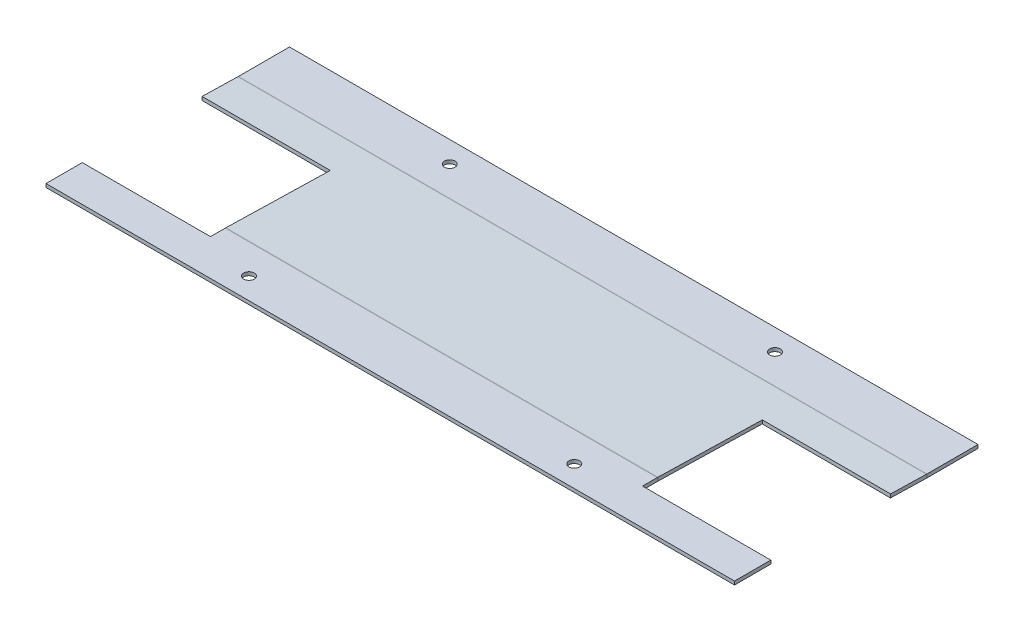
ISO-10303-21;
HEADER;
FILE_DESCRIPTION(('STEP AP214'),'2;1');
FILE_NAME('part.step','',(''),(''),'','','');
FILE_SCHEMA(('AUTOMOTIVE_DESIGN { 1 0 10303 214 1 1 1 1 }'));
ENDSEC;
DATA;
#1=APPLICATION_CONTEXT('core data for automotive mechanical design processes');
#2=APPLICATION_PROTOCOL_DEFINITION('international standard','automotive_design',2000,#1);
#3=PRODUCT_CONTEXT('',#1,'mechanical');
#4=PRODUCT('Part','Part','',(#3));
#5=PRODUCT_RELATED_PRODUCT_CATEGORY('part','',(#4));
#6=PRODUCT_DEFINITION_FORMATION('','',#4);
#7=PRODUCT_DEFINITION_CONTEXT('part definition',#1,'design');
#8=PRODUCT_DEFINITION('design','',#6,#7);
#9=PRODUCT_DEFINITION_SHAPE('','',#8);
#10=(LENGTH_UNIT() NAMED_UNIT(*) SI_UNIT(.MILLI.,.METRE.));
#11=(NAMED_UNIT(*) PLANE_ANGLE_UNIT() SI_UNIT($,.RADIAN.));
#12=(NAMED_UNIT(*) SI_UNIT($,.STERADIAN.) SOLID_ANGLE_UNIT());
#13=UNCERTAINTY_MEASURE_WITH_UNIT(LENGTH_MEASURE(1.E-05),#10,'distance_accuracy_value','');
#14=(GEOMETRIC_REPRESENTATION_CONTEXT(3) GLOBAL_UNCERTAINTY_ASSIGNED_CONTEXT((#13)) GLOBAL_UNIT_ASSIGNED_CONTEXT((#10,
#11,#12)) REPRESENTATION_CONTEXT('',''));
#15=CARTESIAN_POINT('',(0.,0.,0.));
#16=DIRECTION('',(0.,0.,1.));
#17=DIRECTION('',(1.,0.,0.));
#18=AXIS2_PLACEMENT_3D('',#15,#16,#17);
#19=CARTESIAN_POINT('',(-201.34,0.,-97.4));
#20=DIRECTION('',(1.,0.,0.));
#21=DIRECTION('',(0.,0.0246284496077068,0.999696673731548));
#22=AXIS2_PLACEMENT_3D('',#19,#20,#21);
#23=PLANE('',#22);
#24=DIRECTION('',(0.,-0.0246284496077068,-0.999696673731548));
#25=VECTOR('',#24,1.);
#26=CARTESIAN_POINT('',(-201.34,0.36869912172874,-0.00908324292608424));
#27=LINE('',#26,#25);
#28=CARTESIAN_POINT('',(-201.34,-2.02635098499052,-97.22688067823));
#29=VERTEX_POINT('',#28);
#30=CARTESIAN_POINT('',(-201.34,-1.5086422619199,-76.2124970422602));
#31=VERTEX_POINT('',#30);
#32=EDGE_CURVE('E284',#29,#31,#27,.F.);
#33=ORIENTED_EDGE('',*,*,#32,.T.);
#34=DIRECTION('',(0.,0.999696673731548,-0.0246284496077068));
#35=VECTOR('',#34,1.);
#36=CARTESIAN_POINT('',(-201.34,-1.5086422619199,-76.2124970422602));
#37=LINE('',#36,#35);
#38=CARTESIAN_POINT('',(-201.34,0.520741985755138,-76.2624927949639));
#39=VERTEX_POINT('',#38);
#40=EDGE_CURVE('E346',#39,#31,#37,.F.);
#41=ORIENTED_EDGE('',*,*,#40,.F.);
#42=DIRECTION('',(0.,0.0246284496077068,0.999696673731548));
#43=VECTOR('',#42,1.);
#44=CARTESIAN_POINT('',(-201.34,0.,-97.4));
#45=LINE('',#44,#43);
#46=CARTESIAN_POINT('',(-201.34,0.00303326268452368,-97.2768764309336));
#47=VERTEX_POINT('',#46);
#48=EDGE_CURVE('E229',#47,#39,#45,.T.);
#49=ORIENTED_EDGE('',*,*,#48,.F.);
#50=DIRECTION('',(0.,0.999696673731548,-0.0246284496077068));
#51=VECTOR('',#50,1.);
#52=CARTESIAN_POINT('',(-201.34,0.00303326268452368,-97.2768764309336));
#53=LINE('',#52,#51);
#54=EDGE_CURVE('E12',#29,#47,#53,.T.);
#55=ORIENTED_EDGE('',*,*,#54,.F.);
#56=EDGE_LOOP('',(#33,#41,#49,#55));
#57=FACE_BOUND('',#56,.T.);
#58=ADVANCED_FACE('F51',(#57),#23,.F.);
#59=CARTESIAN_POINT('',(-201.34,2.03,15.));
#60=DIRECTION('',(1.,0.,0.));
#61=DIRECTION('',(0.,0.,1.));
#62=AXIS2_PLACEMENT_3D('',#59,#60,#61);
#63=PLANE('',#62);
#64=DIRECTION('',(0.,0.,1.));
#65=VECTOR('',#64,1.);
#66=CARTESIAN_POINT('',(-201.34,2.03,15.));
#67=LINE('',#66,#65);
#68=CARTESIAN_POINT('',(-201.34,2.03,-6.21249704226017));
#69=VERTEX_POINT('',#68);
#70=CARTESIAN_POINT('',(-201.34,2.03,15.));
#71=VERTEX_POINT('',#70);
#72=EDGE_CURVE('E217',#69,#71,#67,.T.);
#73=ORIENTED_EDGE('',*,*,#72,.F.);
#74=DIRECTION('',(0.,1.,0.));
#75=VECTOR('',#74,1.);
#76=CARTESIAN_POINT('',(-201.34,0.,-6.21249704226017));
#77=LINE('',#76,#75);
#78=CARTESIAN_POINT('',(-201.34,0.,-6.21249704226017));
#79=VERTEX_POINT('',#78);
#80=EDGE_CURVE('E350',#69,#79,#77,.F.);
#81=ORIENTED_EDGE('',*,*,#80,.T.);
#82=DIRECTION('',(0.,0.,-1.));
#83=VECTOR('',#82,1.);
#84=CARTESIAN_POINT('',(-201.34,0.,0.));
#85=LINE('',#84,#83);
#86=CARTESIAN_POINT('',(-201.34,0.,15.));
#87=VERTEX_POINT('',#86);
#88=EDGE_CURVE('E286',#79,#87,#85,.F.);
#89=ORIENTED_EDGE('',*,*,#88,.T.);
#90=DIRECTION('',(0.,1.,0.));
#91=VECTOR('',#90,1.);
#92=CARTESIAN_POINT('',(-201.34,2.03,15.));
#93=LINE('',#92,#91);
#94=EDGE_CURVE('E60',#87,#71,#93,.T.);
#95=ORIENTED_EDGE('',*,*,#94,.T.);
#96=EDGE_LOOP('',(#73,#81,#89,#95));
#97=FACE_BOUND('',#96,.T.);
#98=ADVANCED_FACE('F423',(#97),#63,.F.);
#99=CARTESIAN_POINT('',(201.34,2.03,15.));
#100=DIRECTION('',(-1.,0.,0.));
#101=DIRECTION('',(0.,0.,-1.));
#102=AXIS2_PLACEMENT_3D('',#99,#100,#101);
#103=PLANE('',#102);
#104=DIRECTION('',(0.,0.,-1.));
#105=VECTOR('',#104,1.);
#106=CARTESIAN_POINT('',(201.34,0.,0.));
#107=LINE('',#106,#105);
#108=CARTESIAN_POINT('',(201.34,0.,15.));
#109=VERTEX_POINT('',#108);
#110=CARTESIAN_POINT('',(201.34,0.,-6.21249704226018));
#111=VERTEX_POINT('',#110);
#112=EDGE_CURVE('E210',#109,#111,#107,.T.);
#113=ORIENTED_EDGE('',*,*,#112,.T.);
#114=DIRECTION('',(0.,-1.,0.));
#115=VECTOR('',#114,1.);
#116=CARTESIAN_POINT('',(201.34,2.03,-6.21249704226018));
#117=LINE('',#116,#115);
#118=CARTESIAN_POINT('',(201.34,2.03,-6.21249704226018));
#119=VERTEX_POINT('',#118);
#120=EDGE_CURVE('E194',#111,#119,#117,.F.);
#121=ORIENTED_EDGE('',*,*,#120,.T.);
#122=DIRECTION('',(0.,0.,-1.));
#123=VECTOR('',#122,1.);
#124=CARTESIAN_POINT('',(201.34,2.03,15.));
#125=LINE('',#124,#123);
#126=CARTESIAN_POINT('',(201.34,2.03,15.));
#127=VERTEX_POINT('',#126);
#128=EDGE_CURVE('E208',#127,#119,#125,.T.);
#129=ORIENTED_EDGE('',*,*,#128,.F.);
#130=DIRECTION('',(0.,1.,0.));
#131=VECTOR('',#130,1.);
#132=CARTESIAN_POINT('',(201.34,2.03,15.));
#133=LINE('',#132,#131);
#134=EDGE_CURVE('E303',#109,#127,#133,.T.);
#135=ORIENTED_EDGE('',*,*,#134,.F.);
#136=EDGE_LOOP('',(#113,#121,#129,#135));
#137=FACE_BOUND('',#136,.T.);
#138=ADVANCED_FACE('F207',(#137),#103,.F.);
#139=CARTESIAN_POINT('',(201.34,0.,-97.4));
#140=DIRECTION('',(1.,0.,0.));
#141=DIRECTION('',(0.,0.0246284496077068,0.999696673731548));
#142=AXIS2_PLACEMENT_3D('',#139,#140,#141);
#143=PLANE('',#142);
#144=DIRECTION('',(0.,0.0246284496077068,0.999696673731548));
#145=VECTOR('',#144,1.);
#146=CARTESIAN_POINT('',(201.34,0.,-97.4));
#147=LINE('',#146,#145);
#148=CARTESIAN_POINT('',(201.34,0.00303326268452368,-97.2768764309336));
#149=VERTEX_POINT('',#148);
#150=CARTESIAN_POINT('',(201.34,0.520741985755139,-76.2624927949638));
#151=VERTEX_POINT('',#150);
#152=EDGE_CURVE('E238',#149,#151,#147,.T.);
#153=ORIENTED_EDGE('',*,*,#152,.T.);
#154=DIRECTION('',(0.,0.999696673731548,-0.0246284496077068));
#155=VECTOR('',#154,1.);
#156=CARTESIAN_POINT('',(201.34,-1.5086422619199,-76.2124970422602));
#157=LINE('',#156,#155);
#158=CARTESIAN_POINT('',(201.34,-1.5086422619199,-76.2124970422602));
#159=VERTEX_POINT('',#158);
#160=EDGE_CURVE('E383',#151,#159,#157,.F.);
#161=ORIENTED_EDGE('',*,*,#160,.T.);
#162=DIRECTION('',(0.,-0.0246284496077068,-0.999696673731548));
#163=VECTOR('',#162,1.);
#164=CARTESIAN_POINT('',(201.34,0.36869912172874,-0.00908324292608424));
#165=LINE('',#164,#163);
#166=CARTESIAN_POINT('',(201.34,-2.02635098499052,-97.22688067823));
#167=VERTEX_POINT('',#166);
#168=EDGE_CURVE('E277',#167,#159,#165,.F.);
#169=ORIENTED_EDGE('',*,*,#168,.F.);
#170=DIRECTION('',(0.,0.999696673731548,-0.0246284496077068));
#171=VECTOR('',#170,1.);
#172=CARTESIAN_POINT('',(201.34,0.00303326268452368,-97.2768764309336));
#173=LINE('',#172,#171);
#174=EDGE_CURVE('E301',#167,#149,#173,.T.);
#175=ORIENTED_EDGE('',*,*,#174,.T.);
#176=EDGE_LOOP('',(#153,#161,#169,#175));
#177=FACE_BOUND('',#176,.T.);
#178=ADVANCED_FACE('F472',(#177),#143,.T.);
#179=CARTESIAN_POINT('',(0.,2.39808336940378,-0.059078995629729));
#180=DIRECTION('',(0.,-0.999696673731548,0.0246284496077068));
#181=DIRECTION('',(0.,-0.0246284496077068,-0.999696673731548));
#182=AXIS2_PLACEMENT_3D('',#179,#180,#181);
#183=PLANE('',#182);
#184=DIRECTION('',(1.,0.,0.));
#185=VECTOR('',#184,1.);
#186=CARTESIAN_POINT('',(-163.84,0.520741985755138,-76.2624927949639));
#187=LINE('',#186,#185);
#188=CARTESIAN_POINT('',(-126.34,0.520741985755138,-76.2624927949639));
#189=VERTEX_POINT('',#188);
#190=EDGE_CURVE('E343',#189,#39,#187,.F.);
#191=ORIENTED_EDGE('',*,*,#190,.F.);
#192=DIRECTION('',(0.,0.0246284496077068,0.999696673731548));
#193=VECTOR('',#192,1.);
#194=CARTESIAN_POINT('',(-126.34,1.27354648537283,-45.7053052242753));
#195=LINE('',#194,#193);
#196=CARTESIAN_POINT('',(-126.34,2.02635098499052,-15.1481176535867));
#197=VERTEX_POINT('',#196);
#198=EDGE_CURVE('E348',#197,#189,#195,.F.);
#199=ORIENTED_EDGE('',*,*,#198,.F.);
#200=DIRECTION('',(-1.,0.,0.));
#201=VECTOR('',#200,1.);
#202=CARTESIAN_POINT('',(0.,2.02635098499052,-15.1481176535867));
#203=LINE('',#202,#201);
#204=CARTESIAN_POINT('',(126.34,2.02635098499051,-15.1481176535867));
#205=VERTEX_POINT('',#204);
#206=EDGE_CURVE('E253',#197,#205,#203,.F.);
#207=ORIENTED_EDGE('',*,*,#206,.T.);
#208=DIRECTION('',(0.,0.0246284496077068,0.999696673731548));
#209=VECTOR('',#208,1.);
#210=CARTESIAN_POINT('',(126.34,1.27354648537283,-45.7053052242753));
#211=LINE('',#210,#209);
#212=CARTESIAN_POINT('',(126.34,0.520741985755139,-76.2624927949638));
#213=VERTEX_POINT('',#212);
#214=EDGE_CURVE('E375',#213,#205,#211,.T.);
#215=ORIENTED_EDGE('',*,*,#214,.F.);
#216=DIRECTION('',(1.,0.,0.));
#217=VECTOR('',#216,1.);
#218=CARTESIAN_POINT('',(163.84,0.520741985755139,-76.2624927949638));
#219=LINE('',#218,#217);
#220=EDGE_CURVE('E337',#151,#213,#219,.F.);
#221=ORIENTED_EDGE('',*,*,#220,.F.);
#222=ORIENTED_EDGE('',*,*,#152,.F.);
#223=DIRECTION('',(1.,0.,0.));
#224=VECTOR('',#223,1.);
#225=CARTESIAN_POINT('',(-201.34,0.00303326268452338,-97.2768764309336));
#226=LINE('',#225,#224);
#227=EDGE_CURVE('E244',#149,#47,#226,.F.);
#228=ORIENTED_EDGE('',*,*,#227,.T.);
#229=ORIENTED_EDGE('',*,*,#48,.T.);
#230=EDGE_LOOP('',(#191,#199,#207,#215,#221,#222,#228,#229));
#231=FACE_BOUND('',#230,.T.);
#232=ADVANCED_FACE('F483',(#231),#183,.F.);
#233=CARTESIAN_POINT('',(0.,2.03,0.));
#234=DIRECTION('',(0.,-1.,0.));
#235=DIRECTION('',(0.,0.,-1.));
#236=AXIS2_PLACEMENT_3D('',#233,#234,#235);
#237=PLANE('',#236);
#238=CARTESIAN_POINT('',(95.116996944207,2.03,2.4999999999995));
#239=DIRECTION('',(0.,-1.,0.));
#240=DIRECTION('',(0.,0.,-1.));
#241=AXIS2_PLACEMENT_3D('',#238,#239,#240);
#242=CIRCLE('',#241,3.10000000000531);
#243=CARTESIAN_POINT('',(95.116996944207,2.03,-0.600000000005809));
#244=VERTEX_POINT('',#243);
#245=EDGE_CURVE('E317',#244,#244,#242,.T.);
#246=ORIENTED_EDGE('',*,*,#245,.T.);
#247=EDGE_LOOP('',(#246));
#248=FACE_BOUND('',#247,.T.);
#249=CARTESIAN_POINT('',(-95.116999999997,2.03,2.49999999999884));
#250=DIRECTION('',(0.,-1.,0.));
#251=DIRECTION('',(0.,0.,-1.));
#252=AXIS2_PLACEMENT_3D('',#249,#250,#251);
#253=CIRCLE('',#252,3.09999999999999);
#254=CARTESIAN_POINT('',(-95.116999999997,2.03,-0.600000000001152));
#255=VERTEX_POINT('',#254);
#256=EDGE_CURVE('E322',#255,#255,#253,.T.);
#257=ORIENTED_EDGE('',*,*,#256,.T.);
#258=EDGE_LOOP('',(#257));
#259=FACE_BOUND('',#258,.T.);
#260=DIRECTION('',(1.,0.,0.));
#261=VECTOR('',#260,1.);
#262=CARTESIAN_POINT('',(-163.84,2.03,-6.21249704226017));
#263=LINE('',#262,#261);
#264=CARTESIAN_POINT('',(-126.34,2.03,-6.21249704226018));
#265=VERTEX_POINT('',#264);
#266=EDGE_CURVE('E363',#69,#265,#263,.T.);
#267=ORIENTED_EDGE('',*,*,#266,.F.);
#268=ORIENTED_EDGE('',*,*,#72,.T.);
#269=DIRECTION('',(1.,0.,0.));
#270=VECTOR('',#269,1.);
#271=CARTESIAN_POINT('',(-201.34,2.03,15.));
#272=LINE('',#271,#270);
#273=EDGE_CURVE('E216',#71,#127,#272,.T.);
#274=ORIENTED_EDGE('',*,*,#273,.T.);
#275=ORIENTED_EDGE('',*,*,#128,.T.);
#276=DIRECTION('',(-1.,0.,0.));
#277=VECTOR('',#276,1.);
#278=CARTESIAN_POINT('',(0.,2.03,-6.21249704226015));
#279=LINE('',#278,#277);
#280=CARTESIAN_POINT('',(126.34,2.03,-6.21249704226017));
#281=VERTEX_POINT('',#280);
#282=EDGE_CURVE('E191',#119,#281,#279,.T.);
#283=ORIENTED_EDGE('',*,*,#282,.T.);
#284=DIRECTION('',(0.,0.,-1.));
#285=VECTOR('',#284,1.);
#286=CARTESIAN_POINT('',(126.34,2.03,0.));
#287=LINE('',#286,#285);
#288=CARTESIAN_POINT('',(126.34,2.03,-14.851837404806));
#289=VERTEX_POINT('',#288);
#290=EDGE_CURVE('E201',#281,#289,#287,.T.);
#291=ORIENTED_EDGE('',*,*,#290,.T.);
#292=DIRECTION('',(-1.,0.,0.));
#293=VECTOR('',#292,1.);
#294=CARTESIAN_POINT('',(0.,2.03,-14.851837404806));
#295=LINE('',#294,#293);
#296=CARTESIAN_POINT('',(-126.34,2.03,-14.851837404806));
#297=VERTEX_POINT('',#296);
#298=EDGE_CURVE('E247',#289,#297,#295,.T.);
#299=ORIENTED_EDGE('',*,*,#298,.T.);
#300=DIRECTION('',(0.,0.,1.));
#301=VECTOR('',#300,1.);
#302=CARTESIAN_POINT('',(-126.34,2.03,-10.5321672235331));
#303=LINE('',#302,#301);
#304=EDGE_CURVE('E359',#265,#297,#303,.F.);
#305=ORIENTED_EDGE('',*,*,#304,.F.);
#306=EDGE_LOOP('',(#267,#268,#274,#275,#283,#291,#299,#305));
#307=FACE_BOUND('',#306,.T.);
#308=ADVANCED_FACE('F214',(#248,#259,#307),#237,.F.);
#309=CARTESIAN_POINT('',(0.,-10.,-14.851837404806));
#310=DIRECTION('',(-1.,0.,0.));
#311=DIRECTION('',(0.,0.,1.));
#312=AXIS2_PLACEMENT_3D('',#309,#310,#311);
#313=CYLINDRICAL_SURFACE('',#312,12.03);
#314=ORIENTED_EDGE('',*,*,#206,.F.);
#315=CARTESIAN_POINT('',(-126.34,-10.,-14.851837404806));
#316=DIRECTION('',(1.,0.,0.));
#317=DIRECTION('',(0.,0.,-1.));
#318=AXIS2_PLACEMENT_3D('',#315,#316,#317);
#319=CIRCLE('',#318,12.03);
#320=EDGE_CURVE('E225',#197,#297,#319,.T.);
#321=ORIENTED_EDGE('',*,*,#320,.T.);
#322=ORIENTED_EDGE('',*,*,#298,.F.);
#323=CARTESIAN_POINT('',(126.34,-10.,-14.851837404806));
#324=DIRECTION('',(-1.,0.,0.));
#325=DIRECTION('',(0.,0.,1.));
#326=AXIS2_PLACEMENT_3D('',#323,#324,#325);
#327=CIRCLE('',#326,12.03);
#328=EDGE_CURVE('E365',#289,#205,#327,.T.);
#329=ORIENTED_EDGE('',*,*,#328,.T.);
#330=EDGE_LOOP('',(#314,#321,#322,#329));
#331=FACE_BOUND('',#330,.T.);
#332=ADVANCED_FACE('F402',(#331),#313,.T.);
#333=CARTESIAN_POINT('',(0.,0.36869912172874,-0.00908324292608424));
#334=DIRECTION('',(0.,-0.999696673731548,0.0246284496077068));
#335=DIRECTION('',(0.,-0.0246284496077068,-0.999696673731548));
#336=AXIS2_PLACEMENT_3D('',#333,#334,#335);
#337=PLANE('',#336);
#338=DIRECTION('',(0.,-0.0246284496077068,-0.999696673731548));
#339=VECTOR('',#338,1.);
#340=CARTESIAN_POINT('',(-126.34,0.36869912172874,-0.00908324292608424));
#341=LINE('',#340,#339);
#342=CARTESIAN_POINT('',(-126.34,-0.0030332626845211,-15.0981219008831));
#343=VERTEX_POINT('',#342);
#344=CARTESIAN_POINT('',(-126.34,-1.5086422619199,-76.2124970422602));
#345=VERTEX_POINT('',#344);
#346=EDGE_CURVE('E339',#343,#345,#341,.T.);
#347=ORIENTED_EDGE('',*,*,#346,.T.);
#348=DIRECTION('',(-1.,0.,0.));
#349=VECTOR('',#348,1.);
#350=CARTESIAN_POINT('',(0.,-1.5086422619199,-76.2124970422602));
#351=LINE('',#350,#349);
#352=EDGE_CURVE('E342',#345,#31,#351,.T.);
#353=ORIENTED_EDGE('',*,*,#352,.T.);
#354=ORIENTED_EDGE('',*,*,#32,.F.);
#355=DIRECTION('',(1.,0.,0.));
#356=VECTOR('',#355,1.);
#357=CARTESIAN_POINT('',(0.,-2.02635098499052,-97.22688067823));
#358=LINE('',#357,#356);
#359=EDGE_CURVE('E260',#167,#29,#358,.F.);
#360=ORIENTED_EDGE('',*,*,#359,.F.);
#361=ORIENTED_EDGE('',*,*,#168,.T.);
#362=DIRECTION('',(-1.,0.,0.));
#363=VECTOR('',#362,1.);
#364=CARTESIAN_POINT('',(0.,-1.5086422619199,-76.2124970422602));
#365=LINE('',#364,#363);
#366=CARTESIAN_POINT('',(126.34,-1.5086422619199,-76.2124970422602));
#367=VERTEX_POINT('',#366);
#368=EDGE_CURVE('E371',#159,#367,#365,.T.);
#369=ORIENTED_EDGE('',*,*,#368,.T.);
#370=DIRECTION('',(0.,0.0246284496077068,0.999696673731548));
#371=VECTOR('',#370,1.);
#372=CARTESIAN_POINT('',(126.34,0.36869912172874,-0.00908324292608424));
#373=LINE('',#372,#371);
#374=CARTESIAN_POINT('',(126.34,-0.00303326268452295,-15.0981219008831));
#375=VERTEX_POINT('',#374);
#376=EDGE_CURVE('E374',#367,#375,#373,.T.);
#377=ORIENTED_EDGE('',*,*,#376,.T.);
#378=DIRECTION('',(1.,0.,0.));
#379=VECTOR('',#378,1.);
#380=CARTESIAN_POINT('',(0.,-0.0030332626845211,-15.0981219008831));
#381=LINE('',#380,#379);
#382=EDGE_CURVE('E249',#343,#375,#381,.T.);
#383=ORIENTED_EDGE('',*,*,#382,.F.);
#384=EDGE_LOOP('',(#347,#353,#354,#360,#361,#369,#377,#383));
#385=FACE_BOUND('',#384,.T.);
#386=ADVANCED_FACE('F452',(#385),#337,.T.);
#387=CARTESIAN_POINT('',(0.,0.,0.));
#388=DIRECTION('',(0.,-1.,0.));
#389=DIRECTION('',(0.,0.,-1.));
#390=AXIS2_PLACEMENT_3D('',#387,#388,#389);
#391=PLANE('',#390);
#392=CARTESIAN_POINT('',(95.116996944207,0.,2.4999999999995));
#393=DIRECTION('',(0.,-1.,0.));
#394=DIRECTION('',(0.,0.,-1.));
#395=AXIS2_PLACEMENT_3D('',#392,#393,#394);
#396=CIRCLE('',#395,3.10000000000531);
#397=CARTESIAN_POINT('',(95.116996944207,0.,-0.600000000005809));
#398=VERTEX_POINT('',#397);
#399=EDGE_CURVE('E55',#398,#398,#396,.T.);
#400=ORIENTED_EDGE('',*,*,#399,.F.);
#401=EDGE_LOOP('',(#400));
#402=FACE_BOUND('',#401,.T.);
#403=CARTESIAN_POINT('',(-95.116999999997,0.,2.49999999999884));
#404=DIRECTION('',(0.,-1.,0.));
#405=DIRECTION('',(0.,0.,-1.));
#406=AXIS2_PLACEMENT_3D('',#403,#404,#405);
#407=CIRCLE('',#406,3.09999999999999);
#408=CARTESIAN_POINT('',(-95.116999999997,0.,-0.600000000001152));
#409=VERTEX_POINT('',#408);
#410=EDGE_CURVE('E315',#409,#409,#407,.T.);
#411=ORIENTED_EDGE('',*,*,#410,.F.);
#412=EDGE_LOOP('',(#411));
#413=FACE_BOUND('',#412,.T.);
#414=ORIENTED_EDGE('',*,*,#88,.F.);
#415=DIRECTION('',(1.,0.,0.));
#416=VECTOR('',#415,1.);
#417=CARTESIAN_POINT('',(-201.34,0.,-6.21249704226017));
#418=LINE('',#417,#416);
#419=CARTESIAN_POINT('',(-126.34,0.,-6.21249704226018));
#420=VERTEX_POINT('',#419);
#421=EDGE_CURVE('E355',#79,#420,#418,.T.);
#422=ORIENTED_EDGE('',*,*,#421,.T.);
#423=DIRECTION('',(0.,0.,-1.));
#424=VECTOR('',#423,1.);
#425=CARTESIAN_POINT('',(-126.34,0.,-6.21249704226018));
#426=LINE('',#425,#424);
#427=CARTESIAN_POINT('',(-126.34,0.,-14.851837404806));
#428=VERTEX_POINT('',#427);
#429=EDGE_CURVE('E358',#420,#428,#426,.T.);
#430=ORIENTED_EDGE('',*,*,#429,.T.);
#431=DIRECTION('',(1.,0.,0.));
#432=VECTOR('',#431,1.);
#433=CARTESIAN_POINT('',(0.,0.,-14.851837404806));
#434=LINE('',#433,#432);
#435=CARTESIAN_POINT('',(126.34,0.,-14.851837404806));
#436=VERTEX_POINT('',#435);
#437=EDGE_CURVE('E264',#436,#428,#434,.F.);
#438=ORIENTED_EDGE('',*,*,#437,.F.);
#439=DIRECTION('',(0.,0.,-1.));
#440=VECTOR('',#439,1.);
#441=CARTESIAN_POINT('',(126.34,0.,-10.5321672235331));
#442=LINE('',#441,#440);
#443=CARTESIAN_POINT('',(126.34,0.,-6.21249704226017));
#444=VERTEX_POINT('',#443);
#445=EDGE_CURVE('E202',#444,#436,#442,.T.);
#446=ORIENTED_EDGE('',*,*,#445,.F.);
#447=DIRECTION('',(1.,0.,0.));
#448=VECTOR('',#447,1.);
#449=CARTESIAN_POINT('',(163.84,0.,-6.21249704226018));
#450=LINE('',#449,#448);
#451=EDGE_CURVE('E332',#111,#444,#450,.F.);
#452=ORIENTED_EDGE('',*,*,#451,.F.);
#453=ORIENTED_EDGE('',*,*,#112,.F.);
#454=DIRECTION('',(1.,0.,0.));
#455=VECTOR('',#454,1.);
#456=CARTESIAN_POINT('',(0.,0.,15.));
#457=LINE('',#456,#455);
#458=EDGE_CURVE('E287',#87,#109,#457,.T.);
#459=ORIENTED_EDGE('',*,*,#458,.F.);
#460=EDGE_LOOP('',(#414,#422,#430,#438,#446,#452,#453,#459));
#461=FACE_BOUND('',#460,.T.);
#462=ADVANCED_FACE('F415',(#402,#413,#461),#391,.T.);
#463=CARTESIAN_POINT('',(0.,-10.,-14.851837404806));
#464=DIRECTION('',(-1.,0.,0.));
#465=DIRECTION('',(0.,0.,1.));
#466=AXIS2_PLACEMENT_3D('',#463,#464,#465);
#467=CYLINDRICAL_SURFACE('',#466,10.);
#468=CARTESIAN_POINT('',(-126.34,-10.,-14.851837404806));
#469=DIRECTION('',(-1.,0.,0.));
#470=DIRECTION('',(0.,0.,1.));
#471=AXIS2_PLACEMENT_3D('',#468,#469,#470);
#472=CIRCLE('',#471,10.);
#473=EDGE_CURVE('E395',#343,#428,#472,.F.);
#474=ORIENTED_EDGE('',*,*,#473,.F.);
#475=ORIENTED_EDGE('',*,*,#382,.T.);
#476=CARTESIAN_POINT('',(126.34,-10.,-14.851837404806));
#477=DIRECTION('',(-1.,0.,0.));
#478=DIRECTION('',(0.,0.,1.));
#479=AXIS2_PLACEMENT_3D('',#476,#477,#478);
#480=CIRCLE('',#479,10.);
#481=EDGE_CURVE('E389',#436,#375,#480,.T.);
#482=ORIENTED_EDGE('',*,*,#481,.F.);
#483=ORIENTED_EDGE('',*,*,#437,.T.);
#484=EDGE_LOOP('',(#474,#475,#482,#483));
#485=FACE_BOUND('',#484,.T.);
#486=ADVANCED_FACE('F411',(#485),#467,.F.);
#487=CARTESIAN_POINT('',(-201.34,2.03,15.));
#488=DIRECTION('',(0.,0.,-1.));
#489=DIRECTION('',(1.,0.,0.));
#490=AXIS2_PLACEMENT_3D('',#487,#488,#489);
#491=PLANE('',#490);
#492=ORIENTED_EDGE('',*,*,#94,.F.);
#493=ORIENTED_EDGE('',*,*,#458,.T.);
#494=ORIENTED_EDGE('',*,*,#134,.T.);
#495=ORIENTED_EDGE('',*,*,#273,.F.);
#496=EDGE_LOOP('',(#492,#493,#494,#495));
#497=FACE_BOUND('',#496,.T.);
#498=ADVANCED_FACE('F427',(#497),#491,.F.);
#499=CARTESIAN_POINT('',(201.34,10.,-97.5231609270107));
#500=DIRECTION('',(-1.,0.,0.));
#501=DIRECTION('',(0.,0.,1.));
#502=AXIS2_PLACEMENT_3D('',#499,#500,#501);
#503=PLANE('',#502);
#504=ORIENTED_EDGE('',*,*,#174,.F.);
#505=CARTESIAN_POINT('',(201.34,10.,-97.5231609270107));
#506=DIRECTION('',(-1.,0.,0.));
#507=DIRECTION('',(0.,0.,1.));
#508=AXIS2_PLACEMENT_3D('',#505,#506,#507);
#509=CIRCLE('',#508,12.03);
#510=CARTESIAN_POINT('',(201.34,-2.03,-97.5231609270107));
#511=VERTEX_POINT('',#510);
#512=EDGE_CURVE('E278',#167,#511,#509,.F.);
#513=ORIENTED_EDGE('',*,*,#512,.T.);
#514=DIRECTION('',(0.,1.,0.));
#515=VECTOR('',#514,1.);
#516=CARTESIAN_POINT('',(201.34,0.,-97.5231609270107));
#517=LINE('',#516,#515);
#518=CARTESIAN_POINT('',(201.34,0.,-97.5231609270107));
#519=VERTEX_POINT('',#518);
#520=EDGE_CURVE('E299',#511,#519,#517,.T.);
#521=ORIENTED_EDGE('',*,*,#520,.T.);
#522=CARTESIAN_POINT('',(201.34,10.,-97.5231609270107));
#523=DIRECTION('',(1.,0.,0.));
#524=DIRECTION('',(0.,0.,-1.));
#525=AXIS2_PLACEMENT_3D('',#522,#523,#524);
#526=CIRCLE('',#525,10.);
#527=EDGE_CURVE('E222',#149,#519,#526,.T.);
#528=ORIENTED_EDGE('',*,*,#527,.F.);
#529=EDGE_LOOP('',(#504,#513,#521,#528));
#530=FACE_BOUND('',#529,.T.);
#531=ADVANCED_FACE('F429',(#530),#503,.F.);
#532=CARTESIAN_POINT('',(201.34,0.,-97.4));
#533=DIRECTION('',(-1.,0.,0.));
#534=DIRECTION('',(0.,0.,-1.));
#535=AXIS2_PLACEMENT_3D('',#532,#533,#534);
#536=PLANE('',#535);
#537=ORIENTED_EDGE('',*,*,#520,.F.);
#538=DIRECTION('',(0.,0.,-1.));
#539=VECTOR('',#538,1.);
#540=CARTESIAN_POINT('',(201.34,-2.03,0.));
#541=LINE('',#540,#539);
#542=CARTESIAN_POINT('',(201.34,-2.03,-127.4));
#543=VERTEX_POINT('',#542);
#544=EDGE_CURVE('E274',#511,#543,#541,.T.);
#545=ORIENTED_EDGE('',*,*,#544,.T.);
#546=DIRECTION('',(0.,1.,0.));
#547=VECTOR('',#546,1.);
#548=CARTESIAN_POINT('',(201.34,0.,-127.4));
#549=LINE('',#548,#547);
#550=CARTESIAN_POINT('',(201.34,0.,-127.4));
#551=VERTEX_POINT('',#550);
#552=EDGE_CURVE('E297',#543,#551,#549,.T.);
#553=ORIENTED_EDGE('',*,*,#552,.T.);
#554=DIRECTION('',(0.,0.,-1.));
#555=VECTOR('',#554,1.);
#556=CARTESIAN_POINT('',(201.34,0.,-97.4));
#557=LINE('',#556,#555);
#558=EDGE_CURVE('E243',#519,#551,#557,.T.);
#559=ORIENTED_EDGE('',*,*,#558,.F.);
#560=EDGE_LOOP('',(#537,#545,#553,#559));
#561=FACE_BOUND('',#560,.T.);
#562=ADVANCED_FACE('F434',(#561),#536,.F.);
#563=CARTESIAN_POINT('',(-201.34,0.,-127.4));
#564=DIRECTION('',(0.,0.,1.));
#565=DIRECTION('',(-1.,0.,0.));
#566=AXIS2_PLACEMENT_3D('',#563,#564,#565);
#567=PLANE('',#566);
#568=ORIENTED_EDGE('',*,*,#552,.F.);
#569=DIRECTION('',(1.,0.,0.));
#570=VECTOR('',#569,1.);
#571=CARTESIAN_POINT('',(0.,-2.03,-127.4));
#572=LINE('',#571,#570);
#573=CARTESIAN_POINT('',(-201.34,-2.03,-127.4));
#574=VERTEX_POINT('',#573);
#575=EDGE_CURVE('E271',#543,#574,#572,.F.);
#576=ORIENTED_EDGE('',*,*,#575,.T.);
#577=DIRECTION('',(0.,1.,0.));
#578=VECTOR('',#577,1.);
#579=CARTESIAN_POINT('',(-201.34,0.,-127.4));
#580=LINE('',#579,#578);
#581=CARTESIAN_POINT('',(-201.34,0.,-127.4));
#582=VERTEX_POINT('',#581);
#583=EDGE_CURVE('E295',#574,#582,#580,.T.);
#584=ORIENTED_EDGE('',*,*,#583,.T.);
#585=DIRECTION('',(-1.,0.,0.));
#586=VECTOR('',#585,1.);
#587=CARTESIAN_POINT('',(-201.34,0.,-127.4));
#588=LINE('',#587,#586);
#589=EDGE_CURVE('E873',#551,#582,#588,.T.);
#590=ORIENTED_EDGE('',*,*,#589,.F.);
#591=EDGE_LOOP('',(#568,#576,#584,#590));
#592=FACE_BOUND('',#591,.T.);
#593=ADVANCED_FACE('F540',(#592),#567,.F.);
#594=CARTESIAN_POINT('',(-201.34,0.,-97.4));
#595=DIRECTION('',(1.,0.,0.));
#596=DIRECTION('',(0.,0.,1.));
#597=AXIS2_PLACEMENT_3D('',#594,#595,#596);
#598=PLANE('',#597);
#599=ORIENTED_EDGE('',*,*,#583,.F.);
#600=DIRECTION('',(0.,0.,-1.));
#601=VECTOR('',#600,1.);
#602=CARTESIAN_POINT('',(-201.34,-2.03,0.));
#603=LINE('',#602,#601);
#604=CARTESIAN_POINT('',(-201.34,-2.03,-97.5231609270107));
#605=VERTEX_POINT('',#604);
#606=EDGE_CURVE('E261',#574,#605,#603,.F.);
#607=ORIENTED_EDGE('',*,*,#606,.T.);
#608=DIRECTION('',(0.,1.,0.));
#609=VECTOR('',#608,1.);
#610=CARTESIAN_POINT('',(-201.34,0.,-97.5231609270107));
#611=LINE('',#610,#609);
#612=CARTESIAN_POINT('',(-201.34,0.,-97.5231609270107));
#613=VERTEX_POINT('',#612);
#614=EDGE_CURVE('E256',#605,#613,#611,.T.);
#615=ORIENTED_EDGE('',*,*,#614,.T.);
#616=DIRECTION('',(0.,0.,1.));
#617=VECTOR('',#616,1.);
#618=CARTESIAN_POINT('',(-201.34,0.,-97.4));
#619=LINE('',#618,#617);
#620=EDGE_CURVE('E869',#582,#613,#619,.T.);
#621=ORIENTED_EDGE('',*,*,#620,.F.);
#622=EDGE_LOOP('',(#599,#607,#615,#621));
#623=FACE_BOUND('',#622,.T.);
#624=ADVANCED_FACE('F463',(#623),#598,.F.);
#625=CARTESIAN_POINT('',(-201.34,10.,-97.5231609270107));
#626=DIRECTION('',(-1.,0.,0.));
#627=DIRECTION('',(0.,0.,1.));
#628=AXIS2_PLACEMENT_3D('',#625,#626,#627);
#629=PLANE('',#628);
#630=CARTESIAN_POINT('',(-201.34,10.,-97.5231609270107));
#631=DIRECTION('',(-1.,0.,0.));
#632=DIRECTION('',(0.,0.,1.));
#633=AXIS2_PLACEMENT_3D('',#630,#631,#632);
#634=CIRCLE('',#633,12.03);
#635=EDGE_CURVE('E281',#605,#29,#634,.T.);
#636=ORIENTED_EDGE('',*,*,#635,.T.);
#637=ORIENTED_EDGE('',*,*,#54,.T.);
#638=CARTESIAN_POINT('',(-201.34,10.,-97.5231609270107));
#639=DIRECTION('',(1.,0.,0.));
#640=DIRECTION('',(0.,0.,-1.));
#641=AXIS2_PLACEMENT_3D('',#638,#639,#640);
#642=CIRCLE('',#641,10.);
#643=EDGE_CURVE('E218',#613,#47,#642,.F.);
#644=ORIENTED_EDGE('',*,*,#643,.F.);
#645=ORIENTED_EDGE('',*,*,#614,.F.);
#646=EDGE_LOOP('',(#636,#637,#644,#645));
#647=FACE_BOUND('',#646,.T.);
#648=ADVANCED_FACE('F53',(#647),#629,.T.);
#649=CARTESIAN_POINT('',(0.,0.,0.));
#650=DIRECTION('',(0.,-1.,0.));
#651=DIRECTION('',(0.,0.,-1.));
#652=AXIS2_PLACEMENT_3D('',#649,#650,#651);
#653=PLANE('',#652);
#654=CARTESIAN_POINT('',(95.1170000000157,0.,-114.900000000002));
#655=DIRECTION('',(0.,-1.,0.));
#656=DIRECTION('',(0.,0.,-1.));
#657=AXIS2_PLACEMENT_3D('',#654,#655,#656);
#658=CIRCLE('',#657,3.09999999999999);
#659=CARTESIAN_POINT('',(95.1170000000157,0.,-118.000000000002));
#660=VERTEX_POINT('',#659);
#661=EDGE_CURVE('E314',#660,#660,#658,.T.);
#662=ORIENTED_EDGE('',*,*,#661,.T.);
#663=EDGE_LOOP('',(#662));
#664=FACE_BOUND('',#663,.T.);
#665=CARTESIAN_POINT('',(-95.1169999999842,0.,-114.900000000005));
#666=DIRECTION('',(0.,-1.,0.));
#667=DIRECTION('',(0.,0.,-1.));
#668=AXIS2_PLACEMENT_3D('',#665,#666,#667);
#669=CIRCLE('',#668,3.09999999999999);
#670=CARTESIAN_POINT('',(-95.1169999999842,0.,-118.000000000005));
#671=VERTEX_POINT('',#670);
#672=EDGE_CURVE('E311',#671,#671,#669,.T.);
#673=ORIENTED_EDGE('',*,*,#672,.T.);
#674=EDGE_LOOP('',(#673));
#675=FACE_BOUND('',#674,.T.);
#676=ORIENTED_EDGE('',*,*,#620,.T.);
#677=DIRECTION('',(1.,0.,0.));
#678=VECTOR('',#677,1.);
#679=CARTESIAN_POINT('',(201.34,0.,-97.5231609270107));
#680=LINE('',#679,#678);
#681=EDGE_CURVE('E239',#613,#519,#680,.T.);
#682=ORIENTED_EDGE('',*,*,#681,.T.);
#683=ORIENTED_EDGE('',*,*,#558,.T.);
#684=ORIENTED_EDGE('',*,*,#589,.T.);
#685=EDGE_LOOP('',(#676,#682,#683,#684));
#686=FACE_BOUND('',#685,.T.);
#687=ADVANCED_FACE('F519',(#664,#675,#686),#653,.F.);
#688=CARTESIAN_POINT('',(0.,10.,-97.5231609270107));
#689=DIRECTION('',(-1.,0.,0.));
#690=DIRECTION('',(0.,0.,1.));
#691=AXIS2_PLACEMENT_3D('',#688,#689,#690);
#692=CYLINDRICAL_SURFACE('',#691,10.);
#693=ORIENTED_EDGE('',*,*,#643,.T.);
#694=ORIENTED_EDGE('',*,*,#227,.F.);
#695=ORIENTED_EDGE('',*,*,#527,.T.);
#696=ORIENTED_EDGE('',*,*,#681,.F.);
#697=EDGE_LOOP('',(#693,#694,#695,#696));
#698=FACE_BOUND('',#697,.T.);
#699=ADVANCED_FACE('F522',(#698),#692,.F.);
#700=CARTESIAN_POINT('',(0.,-2.03,0.));
#701=DIRECTION('',(0.,-1.,0.));
#702=DIRECTION('',(0.,0.,-1.));
#703=AXIS2_PLACEMENT_3D('',#700,#701,#702);
#704=PLANE('',#703);
#705=CARTESIAN_POINT('',(95.1170000000157,-2.03,-114.900000000002));
#706=DIRECTION('',(0.,-1.,0.));
#707=DIRECTION('',(0.,0.,-1.));
#708=AXIS2_PLACEMENT_3D('',#705,#706,#707);
#709=CIRCLE('',#708,3.09999999999999);
#710=CARTESIAN_POINT('',(95.1170000000157,-2.03,-118.000000000002));
#711=VERTEX_POINT('',#710);
#712=EDGE_CURVE('E312',#711,#711,#709,.T.);
#713=ORIENTED_EDGE('',*,*,#712,.F.);
#714=EDGE_LOOP('',(#713));
#715=FACE_BOUND('',#714,.T.);
#716=CARTESIAN_POINT('',(-95.1169999999842,-2.03,-114.900000000005));
#717=DIRECTION('',(0.,-1.,0.));
#718=DIRECTION('',(0.,0.,-1.));
#719=AXIS2_PLACEMENT_3D('',#716,#717,#718);
#720=CIRCLE('',#719,3.09999999999999);
#721=CARTESIAN_POINT('',(-95.1169999999842,-2.03,-118.000000000005));
#722=VERTEX_POINT('',#721);
#723=EDGE_CURVE('E308',#722,#722,#720,.T.);
#724=ORIENTED_EDGE('',*,*,#723,.F.);
#725=EDGE_LOOP('',(#724));
#726=FACE_BOUND('',#725,.T.);
#727=ORIENTED_EDGE('',*,*,#606,.F.);
#728=ORIENTED_EDGE('',*,*,#575,.F.);
#729=ORIENTED_EDGE('',*,*,#544,.F.);
#730=DIRECTION('',(1.,0.,0.));
#731=VECTOR('',#730,1.);
#732=CARTESIAN_POINT('',(0.,-2.03,-97.5231609270107));
#733=LINE('',#732,#731);
#734=EDGE_CURVE('E257',#605,#511,#733,.T.);
#735=ORIENTED_EDGE('',*,*,#734,.F.);
#736=EDGE_LOOP('',(#727,#728,#729,#735));
#737=FACE_BOUND('',#736,.T.);
#738=ADVANCED_FACE('F467',(#715,#726,#737),#704,.T.);
#739=CARTESIAN_POINT('',(0.,10.,-97.5231609270107));
#740=DIRECTION('',(-1.,0.,0.));
#741=DIRECTION('',(0.,0.,1.));
#742=AXIS2_PLACEMENT_3D('',#739,#740,#741);
#743=CYLINDRICAL_SURFACE('',#742,12.03);
#744=ORIENTED_EDGE('',*,*,#635,.F.);
#745=ORIENTED_EDGE('',*,*,#734,.T.);
#746=ORIENTED_EDGE('',*,*,#512,.F.);
#747=ORIENTED_EDGE('',*,*,#359,.T.);
#748=EDGE_LOOP('',(#744,#745,#746,#747));
#749=FACE_BOUND('',#748,.T.);
#750=ADVANCED_FACE('F459',(#749),#743,.T.);
#751=CARTESIAN_POINT('',(126.34,-10.,-14.851837404806));
#752=DIRECTION('',(1.,0.,0.));
#753=DIRECTION('',(0.,0.,-1.));
#754=AXIS2_PLACEMENT_3D('',#751,#752,#753);
#755=PLANE('',#754);
#756=ORIENTED_EDGE('',*,*,#481,.T.);
#757=DIRECTION('',(0.,-0.999696673731548,0.0246284496077045));
#758=VECTOR('',#757,1.);
#759=CARTESIAN_POINT('',(126.34,2.02635098499051,-15.1481176535867));
#760=LINE('',#759,#758);
#761=EDGE_CURVE('E386',#205,#375,#760,.T.);
#762=ORIENTED_EDGE('',*,*,#761,.F.);
#763=ORIENTED_EDGE('',*,*,#328,.F.);
#764=DIRECTION('',(0.,-1.,0.));
#765=VECTOR('',#764,1.);
#766=CARTESIAN_POINT('',(126.34,2.03,-14.851837404806));
#767=LINE('',#766,#765);
#768=EDGE_CURVE('E76',#289,#436,#767,.T.);
#769=ORIENTED_EDGE('',*,*,#768,.T.);
#770=EDGE_LOOP('',(#756,#762,#763,#769));
#771=FACE_BOUND('',#770,.T.);
#772=ADVANCED_FACE('F510',(#771),#755,.T.);
#773=CARTESIAN_POINT('',(0.,-1.5086422619199,-76.2124970422602));
#774=DIRECTION('',(0.,-0.0246284496077068,-0.999696673731548));
#775=DIRECTION('',(-1.,0.,0.));
#776=AXIS2_PLACEMENT_3D('',#773,#774,#775);
#777=PLANE('',#776);
#778=ORIENTED_EDGE('',*,*,#160,.F.);
#779=ORIENTED_EDGE('',*,*,#220,.T.);
#780=DIRECTION('',(0.,0.999696673731548,-0.0246284496077068));
#781=VECTOR('',#780,1.);
#782=CARTESIAN_POINT('',(126.34,-1.5086422619199,-76.2124970422602));
#783=LINE('',#782,#781);
#784=EDGE_CURVE('E378',#213,#367,#783,.F.);
#785=ORIENTED_EDGE('',*,*,#784,.T.);
#786=ORIENTED_EDGE('',*,*,#368,.F.);
#787=EDGE_LOOP('',(#778,#779,#785,#786));
#788=FACE_BOUND('',#787,.T.);
#789=ADVANCED_FACE('F475',(#788),#777,.F.);
#790=CARTESIAN_POINT('',(126.34,0.36869912172874,-0.00908324292608424));
#791=DIRECTION('',(-1.,0.,0.));
#792=DIRECTION('',(0.,0.0246284496077068,0.999696673731548));
#793=AXIS2_PLACEMENT_3D('',#790,#791,#792);
#794=PLANE('',#793);
#795=ORIENTED_EDGE('',*,*,#784,.F.);
#796=ORIENTED_EDGE('',*,*,#214,.T.);
#797=ORIENTED_EDGE('',*,*,#761,.T.);
#798=ORIENTED_EDGE('',*,*,#376,.F.);
#799=EDGE_LOOP('',(#795,#796,#797,#798));
#800=FACE_BOUND('',#799,.T.);
#801=ADVANCED_FACE('F480',(#800),#794,.F.);
#802=CARTESIAN_POINT('',(126.34,2.03,0.));
#803=DIRECTION('',(-1.,0.,0.));
#804=DIRECTION('',(0.,0.,-1.));
#805=AXIS2_PLACEMENT_3D('',#802,#803,#804);
#806=PLANE('',#805);
#807=DIRECTION('',(0.,-1.,0.));
#808=VECTOR('',#807,1.);
#809=CARTESIAN_POINT('',(126.34,2.03,-6.21249704226017));
#810=LINE('',#809,#808);
#811=EDGE_CURVE('E197',#444,#281,#810,.F.);
#812=ORIENTED_EDGE('',*,*,#811,.F.);
#813=ORIENTED_EDGE('',*,*,#445,.T.);
#814=ORIENTED_EDGE('',*,*,#768,.F.);
#815=ORIENTED_EDGE('',*,*,#290,.F.);
#816=EDGE_LOOP('',(#812,#813,#814,#815));
#817=FACE_BOUND('',#816,.T.);
#818=ADVANCED_FACE('F405',(#817),#806,.F.);
#819=CARTESIAN_POINT('',(0.,2.03,-6.21249704226015));
#820=DIRECTION('',(0.,0.,1.));
#821=DIRECTION('',(-1.,0.,0.));
#822=AXIS2_PLACEMENT_3D('',#819,#820,#821);
#823=PLANE('',#822);
#824=ORIENTED_EDGE('',*,*,#451,.T.);
#825=ORIENTED_EDGE('',*,*,#811,.T.);
#826=ORIENTED_EDGE('',*,*,#282,.F.);
#827=ORIENTED_EDGE('',*,*,#120,.F.);
#828=EDGE_LOOP('',(#824,#825,#826,#827));
#829=FACE_BOUND('',#828,.T.);
#830=ADVANCED_FACE('F193',(#829),#823,.F.);
#831=CARTESIAN_POINT('',(0.,-1.5086422619199,-76.2124970422602));
#832=DIRECTION('',(0.,-0.0246284496077068,-0.999696673731548));
#833=DIRECTION('',(-1.,0.,0.));
#834=AXIS2_PLACEMENT_3D('',#831,#832,#833);
#835=PLANE('',#834);
#836=DIRECTION('',(0.,0.999696673731548,-0.0246284496077068));
#837=VECTOR('',#836,1.);
#838=CARTESIAN_POINT('',(-126.34,-1.5086422619199,-76.2124970422602));
#839=LINE('',#838,#837);
#840=EDGE_CURVE('E352',#189,#345,#839,.F.);
#841=ORIENTED_EDGE('',*,*,#840,.F.);
#842=ORIENTED_EDGE('',*,*,#190,.T.);
#843=ORIENTED_EDGE('',*,*,#40,.T.);
#844=ORIENTED_EDGE('',*,*,#352,.F.);
#845=EDGE_LOOP('',(#841,#842,#843,#844));
#846=FACE_BOUND('',#845,.T.);
#847=ADVANCED_FACE('F489',(#846),#835,.F.);
#848=CARTESIAN_POINT('',(-126.34,0.36869912172874,-0.00908324292608424));
#849=DIRECTION('',(1.,0.,0.));
#850=DIRECTION('',(0.,-0.0246284496077068,-0.999696673731548));
#851=AXIS2_PLACEMENT_3D('',#848,#849,#850);
#852=PLANE('',#851);
#853=ORIENTED_EDGE('',*,*,#198,.T.);
#854=ORIENTED_EDGE('',*,*,#840,.T.);
#855=ORIENTED_EDGE('',*,*,#346,.F.);
#856=DIRECTION('',(0.,-0.999696673731548,0.0246284496077045));
#857=VECTOR('',#856,1.);
#858=CARTESIAN_POINT('',(-126.34,2.02635098499051,-15.1481176535867));
#859=LINE('',#858,#857);
#860=EDGE_CURVE('E68',#197,#343,#859,.T.);
#861=ORIENTED_EDGE('',*,*,#860,.F.);
#862=EDGE_LOOP('',(#853,#854,#855,#861));
#863=FACE_BOUND('',#862,.T.);
#864=ADVANCED_FACE('F487',(#863),#852,.F.);
#865=CARTESIAN_POINT('',(-126.34,-10.,-14.851837404806));
#866=DIRECTION('',(-1.,0.,0.));
#867=DIRECTION('',(0.,0.,1.));
#868=AXIS2_PLACEMENT_3D('',#865,#866,#867);
#869=PLANE('',#868);
#870=ORIENTED_EDGE('',*,*,#473,.T.);
#871=DIRECTION('',(0.,-1.,0.));
#872=VECTOR('',#871,1.);
#873=CARTESIAN_POINT('',(-126.34,2.03,-14.851837404806));
#874=LINE('',#873,#872);
#875=EDGE_CURVE('E394',#297,#428,#874,.T.);
#876=ORIENTED_EDGE('',*,*,#875,.F.);
#877=ORIENTED_EDGE('',*,*,#320,.F.);
#878=ORIENTED_EDGE('',*,*,#860,.T.);
#879=EDGE_LOOP('',(#870,#876,#877,#878));
#880=FACE_BOUND('',#879,.T.);
#881=ADVANCED_FACE('F496',(#880),#869,.T.);
#882=CARTESIAN_POINT('',(-201.34,0.,-6.21249704226017));
#883=DIRECTION('',(0.,0.,1.));
#884=DIRECTION('',(1.,0.,0.));
#885=AXIS2_PLACEMENT_3D('',#882,#883,#884);
#886=PLANE('',#885);
#887=ORIENTED_EDGE('',*,*,#80,.F.);
#888=ORIENTED_EDGE('',*,*,#266,.T.);
#889=DIRECTION('',(0.,1.,0.));
#890=VECTOR('',#889,1.);
#891=CARTESIAN_POINT('',(-126.34,0.,-6.21249704226018));
#892=LINE('',#891,#890);
#893=EDGE_CURVE('E362',#265,#420,#892,.F.);
#894=ORIENTED_EDGE('',*,*,#893,.T.);
#895=ORIENTED_EDGE('',*,*,#421,.F.);
#896=EDGE_LOOP('',(#887,#888,#894,#895));
#897=FACE_BOUND('',#896,.T.);
#898=ADVANCED_FACE('F420',(#897),#886,.F.);
#899=CARTESIAN_POINT('',(-126.34,0.,-6.21249704226018));
#900=DIRECTION('',(1.,0.,0.));
#901=DIRECTION('',(0.,0.,-1.));
#902=AXIS2_PLACEMENT_3D('',#899,#900,#901);
#903=PLANE('',#902);
#904=ORIENTED_EDGE('',*,*,#304,.T.);
#905=ORIENTED_EDGE('',*,*,#875,.T.);
#906=ORIENTED_EDGE('',*,*,#429,.F.);
#907=ORIENTED_EDGE('',*,*,#893,.F.);
#908=EDGE_LOOP('',(#904,#905,#906,#907));
#909=FACE_BOUND('',#908,.T.);
#910=ADVANCED_FACE('F418',(#909),#903,.F.);
#911=CARTESIAN_POINT('',(-95.1169999999842,2.03,-114.900000000005));
#912=DIRECTION('',(0.,-1.,0.));
#913=DIRECTION('',(0.,0.,-1.));
#914=AXIS2_PLACEMENT_3D('',#911,#912,#913);
#915=CYLINDRICAL_SURFACE('',#914,3.09999999999999);
#916=ORIENTED_EDGE('',*,*,#723,.T.);
#917=EDGE_LOOP('',(#916));
#918=FACE_BOUND('',#917,.T.);
#919=ORIENTED_EDGE('',*,*,#672,.F.);
#920=EDGE_LOOP('',(#919));
#921=FACE_BOUND('',#920,.T.);
#922=ADVANCED_FACE('F505',(#918,#921),#915,.F.);
#923=CARTESIAN_POINT('',(95.1170000000157,2.03,-114.900000000002));
#924=DIRECTION('',(0.,-1.,0.));
#925=DIRECTION('',(0.,0.,-1.));
#926=AXIS2_PLACEMENT_3D('',#923,#924,#925);
#927=CYLINDRICAL_SURFACE('',#926,3.09999999999999);
#928=ORIENTED_EDGE('',*,*,#712,.T.);
#929=EDGE_LOOP('',(#928));
#930=FACE_BOUND('',#929,.T.);
#931=ORIENTED_EDGE('',*,*,#661,.F.);
#932=EDGE_LOOP('',(#931));
#933=FACE_BOUND('',#932,.T.);
#934=ADVANCED_FACE('F650',(#930,#933),#927,.F.);
#935=CARTESIAN_POINT('',(-95.116999999997,2.03,2.49999999999884));
#936=DIRECTION('',(0.,-1.,0.));
#937=DIRECTION('',(0.,0.,-1.));
#938=AXIS2_PLACEMENT_3D('',#935,#936,#937);
#939=CYLINDRICAL_SURFACE('',#938,3.09999999999999);
#940=ORIENTED_EDGE('',*,*,#410,.T.);
#941=EDGE_LOOP('',(#940));
#942=FACE_BOUND('',#941,.T.);
#943=ORIENTED_EDGE('',*,*,#256,.F.);
#944=EDGE_LOOP('',(#943));
#945=FACE_BOUND('',#944,.T.);
#946=ADVANCED_FACE('F661',(#942,#945),#939,.F.);
#947=CARTESIAN_POINT('',(95.116996944207,2.03,2.4999999999995));
#948=DIRECTION('',(0.,-1.,0.));
#949=DIRECTION('',(0.,0.,-1.));
#950=AXIS2_PLACEMENT_3D('',#947,#948,#949);
#951=CYLINDRICAL_SURFACE('',#950,3.10000000000531);
#952=ORIENTED_EDGE('',*,*,#399,.T.);
#953=EDGE_LOOP('',(#952));
#954=FACE_BOUND('',#953,.T.);
#955=ORIENTED_EDGE('',*,*,#245,.F.);
#956=EDGE_LOOP('',(#955));
#957=FACE_BOUND('',#956,.T.);
#958=ADVANCED_FACE('F672',(#954,#957),#951,.F.);
#959=CLOSED_SHELL('',(#58,#98,#138,#178,#232,#308,#332,#386,#462,#486,#498,#531,#562,#593,#624,
#648,#687,#699,#738,#750,#772,#789,#801,#818,#830,#847,#864,#881,#898,#910,#922,#934,#946,#958));
#960=MANIFOLD_SOLID_BREP('B2',#959);
#961=ADVANCED_BREP_SHAPE_REPRESENTATION('',(#18,#960),#14);
#962=SHAPE_DEFINITION_REPRESENTATION(#9,#961);
ENDSEC;
END-ISO-10303-21;
